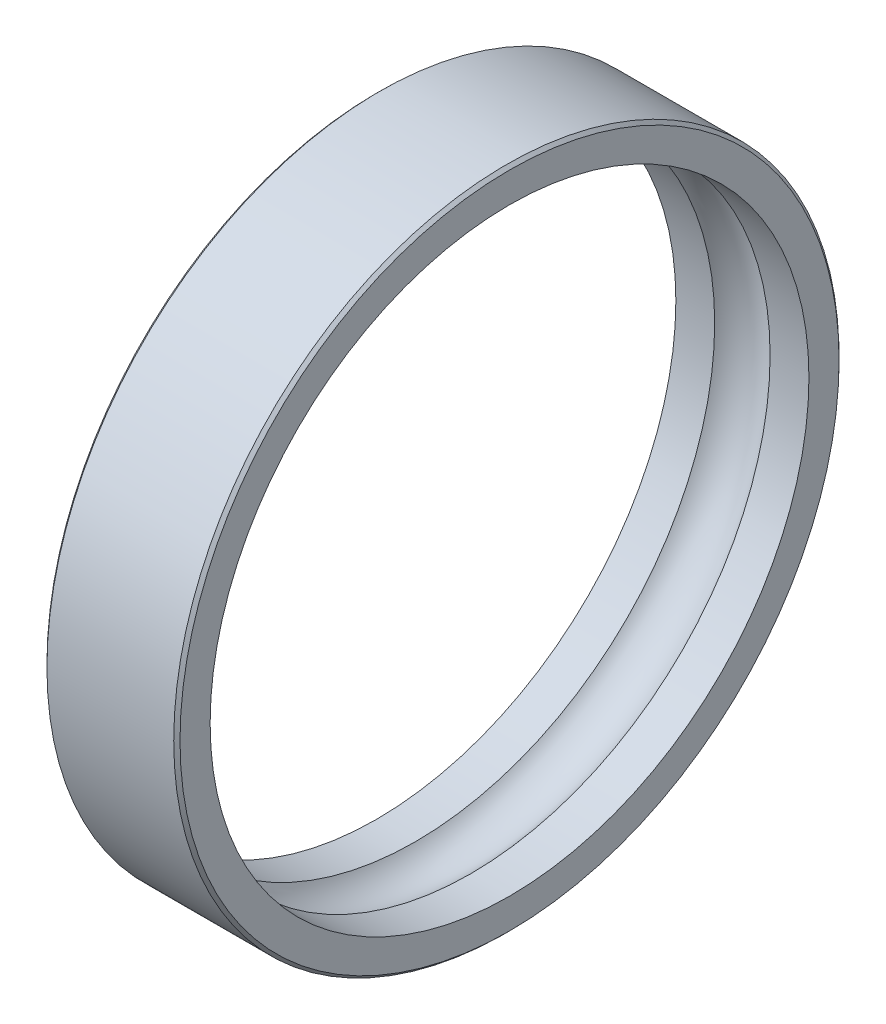
ISO-10303-21;
HEADER;
FILE_DESCRIPTION(('STEP AP214'),'2;1');
FILE_NAME('part.step','',(''),(''),'','','');
FILE_SCHEMA(('AUTOMOTIVE_DESIGN { 1 0 10303 214 1 1 1 1 }'));
ENDSEC;
DATA;
#1=APPLICATION_CONTEXT('core data for automotive mechanical design processes');
#2=APPLICATION_PROTOCOL_DEFINITION('international standard','automotive_design',2000,#1);
#3=PRODUCT_CONTEXT('',#1,'mechanical');
#4=PRODUCT('Part','Part','',(#3));
#5=PRODUCT_RELATED_PRODUCT_CATEGORY('part','',(#4));
#6=PRODUCT_DEFINITION_FORMATION('','',#4);
#7=PRODUCT_DEFINITION_CONTEXT('part definition',#1,'design');
#8=PRODUCT_DEFINITION('design','',#6,#7);
#9=PRODUCT_DEFINITION_SHAPE('','',#8);
#10=(LENGTH_UNIT() NAMED_UNIT(*) SI_UNIT(.MILLI.,.METRE.));
#11=(NAMED_UNIT(*) PLANE_ANGLE_UNIT() SI_UNIT($,.RADIAN.));
#12=(NAMED_UNIT(*) SI_UNIT($,.STERADIAN.) SOLID_ANGLE_UNIT());
#13=UNCERTAINTY_MEASURE_WITH_UNIT(LENGTH_MEASURE(1.E-05),#10,'distance_accuracy_value','');
#14=(GEOMETRIC_REPRESENTATION_CONTEXT(3) GLOBAL_UNCERTAINTY_ASSIGNED_CONTEXT((#13)) GLOBAL_UNIT_ASSIGNED_CONTEXT((#10,
#11,#12)) REPRESENTATION_CONTEXT('',''));
#15=CARTESIAN_POINT('',(0.,0.,0.));
#16=DIRECTION('',(0.,0.,1.));
#17=DIRECTION('',(1.,0.,0.));
#18=AXIS2_PLACEMENT_3D('',#15,#16,#17);
#19=CARTESIAN_POINT('',(1.5,0.,0.));
#20=DIRECTION('',(-1.,0.,0.));
#21=DIRECTION('',(0.,0.,1.));
#22=AXIS2_PLACEMENT_3D('',#19,#20,#21);
#23=CONICAL_SURFACE('',#22,7.42928932188134,0.785398163397448);
#24=CARTESIAN_POINT('',(1.42928932188134,0.,0.));
#25=DIRECTION('',(-1.,0.,0.));
#26=DIRECTION('',(0.,0.,1.));
#27=AXIS2_PLACEMENT_3D('',#24,#25,#26);
#28=CIRCLE('',#27,7.5);
#29=CARTESIAN_POINT('',(1.42928932188134,0.,7.5));
#30=VERTEX_POINT('',#29);
#31=EDGE_CURVE('E10',#30,#30,#28,.T.);
#32=ORIENTED_EDGE('',*,*,#31,.F.);
#33=EDGE_LOOP('',(#32));
#34=FACE_BOUND('',#33,.T.);
#35=CARTESIAN_POINT('',(1.5,0.,0.));
#36=DIRECTION('',(-1.,0.,0.));
#37=DIRECTION('',(0.,0.,1.));
#38=AXIS2_PLACEMENT_3D('',#35,#36,#37);
#39=CIRCLE('',#38,7.42928932188134);
#40=CARTESIAN_POINT('',(1.5,0.,7.42928932188134));
#41=VERTEX_POINT('',#40);
#42=EDGE_CURVE('E63',#41,#41,#39,.T.);
#43=ORIENTED_EDGE('',*,*,#42,.T.);
#44=EDGE_LOOP('',(#43));
#45=FACE_BOUND('',#44,.T.);
#46=ADVANCED_FACE('F35',(#34,#45),#23,.T.);
#47=CARTESIAN_POINT('',(-10.2619693565684,0.,0.));
#48=DIRECTION('',(-1.,0.,0.));
#49=DIRECTION('',(0.,0.,1.));
#50=AXIS2_PLACEMENT_3D('',#47,#48,#49);
#51=CYLINDRICAL_SURFACE('',#50,7.5);
#52=CARTESIAN_POINT('',(-1.42928932188134,0.,0.));
#53=DIRECTION('',(-1.,0.,0.));
#54=DIRECTION('',(0.,0.,1.));
#55=AXIS2_PLACEMENT_3D('',#52,#53,#54);
#56=CIRCLE('',#55,7.5);
#57=CARTESIAN_POINT('',(-1.42928932188134,0.,7.5));
#58=VERTEX_POINT('',#57);
#59=EDGE_CURVE('E41',#58,#58,#56,.T.);
#60=ORIENTED_EDGE('',*,*,#59,.F.);
#61=EDGE_LOOP('',(#60));
#62=FACE_BOUND('',#61,.T.);
#63=ORIENTED_EDGE('',*,*,#31,.T.);
#64=EDGE_LOOP('',(#63));
#65=FACE_BOUND('',#64,.T.);
#66=ADVANCED_FACE('F92',(#62,#65),#51,.T.);
#67=CARTESIAN_POINT('',(-1.5,0.,0.));
#68=DIRECTION('',(1.,0.,0.));
#69=DIRECTION('',(0.,0.,-1.));
#70=AXIS2_PLACEMENT_3D('',#67,#68,#69);
#71=CONICAL_SURFACE('',#70,7.42928932188134,0.785398163397448);
#72=ORIENTED_EDGE('',*,*,#59,.T.);
#73=EDGE_LOOP('',(#72));
#74=FACE_BOUND('',#73,.T.);
#75=CARTESIAN_POINT('',(-1.5,0.,0.));
#76=DIRECTION('',(-1.,0.,0.));
#77=DIRECTION('',(0.,0.,1.));
#78=AXIS2_PLACEMENT_3D('',#75,#76,#77);
#79=CIRCLE('',#78,7.42928932188134);
#80=CARTESIAN_POINT('',(-1.5,0.,7.42928932188134));
#81=VERTEX_POINT('',#80);
#82=EDGE_CURVE('E45',#81,#81,#79,.T.);
#83=ORIENTED_EDGE('',*,*,#82,.F.);
#84=EDGE_LOOP('',(#83));
#85=FACE_BOUND('',#84,.T.);
#86=ADVANCED_FACE('F97',(#74,#85),#71,.T.);
#87=CARTESIAN_POINT('',(-1.5,6.75,0.));
#88=DIRECTION('',(-1.,0.,0.));
#89=DIRECTION('',(0.,0.,1.));
#90=AXIS2_PLACEMENT_3D('',#87,#88,#89);
#91=PLANE('',#90);
#92=ORIENTED_EDGE('',*,*,#82,.T.);
#93=EDGE_LOOP('',(#92));
#94=FACE_BOUND('',#93,.T.);
#95=CARTESIAN_POINT('',(-1.5,0.,0.));
#96=DIRECTION('',(-1.,0.,0.));
#97=DIRECTION('',(0.,0.,1.));
#98=AXIS2_PLACEMENT_3D('',#95,#96,#97);
#99=CIRCLE('',#98,6.75);
#100=CARTESIAN_POINT('',(-1.5,0.,6.75));
#101=VERTEX_POINT('',#100);
#102=EDGE_CURVE('E49',#101,#101,#99,.T.);
#103=ORIENTED_EDGE('',*,*,#102,.F.);
#104=EDGE_LOOP('',(#103));
#105=FACE_BOUND('',#104,.T.);
#106=ADVANCED_FACE('F88',(#94,#105),#91,.T.);
#107=CARTESIAN_POINT('',(-10.2619693565684,0.,0.));
#108=DIRECTION('',(-1.,0.,0.));
#109=DIRECTION('',(0.,0.,1.));
#110=AXIS2_PLACEMENT_3D('',#107,#108,#109);
#111=CYLINDRICAL_SURFACE('',#110,6.75);
#112=CARTESIAN_POINT('',(-0.624499799839841,0.,0.));
#113=DIRECTION('',(-1.,0.,0.));
#114=DIRECTION('',(0.,0.,1.));
#115=AXIS2_PLACEMENT_3D('',#112,#113,#114);
#116=CIRCLE('',#115,6.75);
#117=CARTESIAN_POINT('',(-0.624499799839841,0.,6.75));
#118=VERTEX_POINT('',#117);
#119=EDGE_CURVE('E54',#118,#118,#116,.T.);
#120=ORIENTED_EDGE('',*,*,#119,.F.);
#121=EDGE_LOOP('',(#120));
#122=FACE_BOUND('',#121,.T.);
#123=ORIENTED_EDGE('',*,*,#102,.T.);
#124=EDGE_LOOP('',(#123));
#125=FACE_BOUND('',#124,.T.);
#126=ADVANCED_FACE('F82',(#122,#125),#111,.F.);
#127=CARTESIAN_POINT('',(0.,0.,0.));
#128=DIRECTION('',(-1.,0.,0.));
#129=DIRECTION('',(0.,0.,1.));
#130=AXIS2_PLACEMENT_3D('',#127,#128,#129);
#131=TOROIDAL_SURFACE('',#130,6.25,0.8);
#132=ORIENTED_EDGE('',*,*,#119,.T.);
#133=EDGE_LOOP('',(#132));
#134=FACE_BOUND('',#133,.T.);
#135=CARTESIAN_POINT('',(0.624499799839841,0.,0.));
#136=DIRECTION('',(-1.,0.,0.));
#137=DIRECTION('',(0.,0.,1.));
#138=AXIS2_PLACEMENT_3D('',#135,#136,#137);
#139=CIRCLE('',#138,6.75);
#140=CARTESIAN_POINT('',(0.624499799839841,0.,6.75));
#141=VERTEX_POINT('',#140);
#142=EDGE_CURVE('E57',#141,#141,#139,.T.);
#143=ORIENTED_EDGE('',*,*,#142,.F.);
#144=EDGE_LOOP('',(#143));
#145=FACE_BOUND('',#144,.T.);
#146=ADVANCED_FACE('F77',(#134,#145),#131,.F.);
#147=CARTESIAN_POINT('',(-10.2619693565684,0.,0.));
#148=DIRECTION('',(-1.,0.,0.));
#149=DIRECTION('',(0.,0.,1.));
#150=AXIS2_PLACEMENT_3D('',#147,#148,#149);
#151=CYLINDRICAL_SURFACE('',#150,6.75);
#152=CARTESIAN_POINT('',(1.5,0.,0.));
#153=DIRECTION('',(-1.,0.,0.));
#154=DIRECTION('',(0.,0.,1.));
#155=AXIS2_PLACEMENT_3D('',#152,#153,#154);
#156=CIRCLE('',#155,6.75);
#157=CARTESIAN_POINT('',(1.5,0.,6.75));
#158=VERTEX_POINT('',#157);
#159=EDGE_CURVE('E60',#158,#158,#156,.T.);
#160=ORIENTED_EDGE('',*,*,#159,.F.);
#161=EDGE_LOOP('',(#160));
#162=FACE_BOUND('',#161,.T.);
#163=ORIENTED_EDGE('',*,*,#142,.T.);
#164=EDGE_LOOP('',(#163));
#165=FACE_BOUND('',#164,.T.);
#166=ADVANCED_FACE('F71',(#162,#165),#151,.F.);
#167=CARTESIAN_POINT('',(1.5,6.75,0.));
#168=DIRECTION('',(-1.,0.,0.));
#169=DIRECTION('',(0.,0.,1.));
#170=AXIS2_PLACEMENT_3D('',#167,#168,#169);
#171=PLANE('',#170);
#172=ORIENTED_EDGE('',*,*,#42,.F.);
#173=EDGE_LOOP('',(#172));
#174=FACE_BOUND('',#173,.T.);
#175=ORIENTED_EDGE('',*,*,#159,.T.);
#176=EDGE_LOOP('',(#175));
#177=FACE_BOUND('',#176,.T.);
#178=ADVANCED_FACE('F68',(#174,#177),#171,.F.);
#179=CLOSED_SHELL('',(#46,#66,#86,#106,#126,#146,#166,#178));
#180=MANIFOLD_SOLID_BREP('B2',#179);
#181=ADVANCED_BREP_SHAPE_REPRESENTATION('',(#18,#180),#14);
#182=SHAPE_DEFINITION_REPRESENTATION(#9,#181);
ENDSEC;
END-ISO-10303-21;
